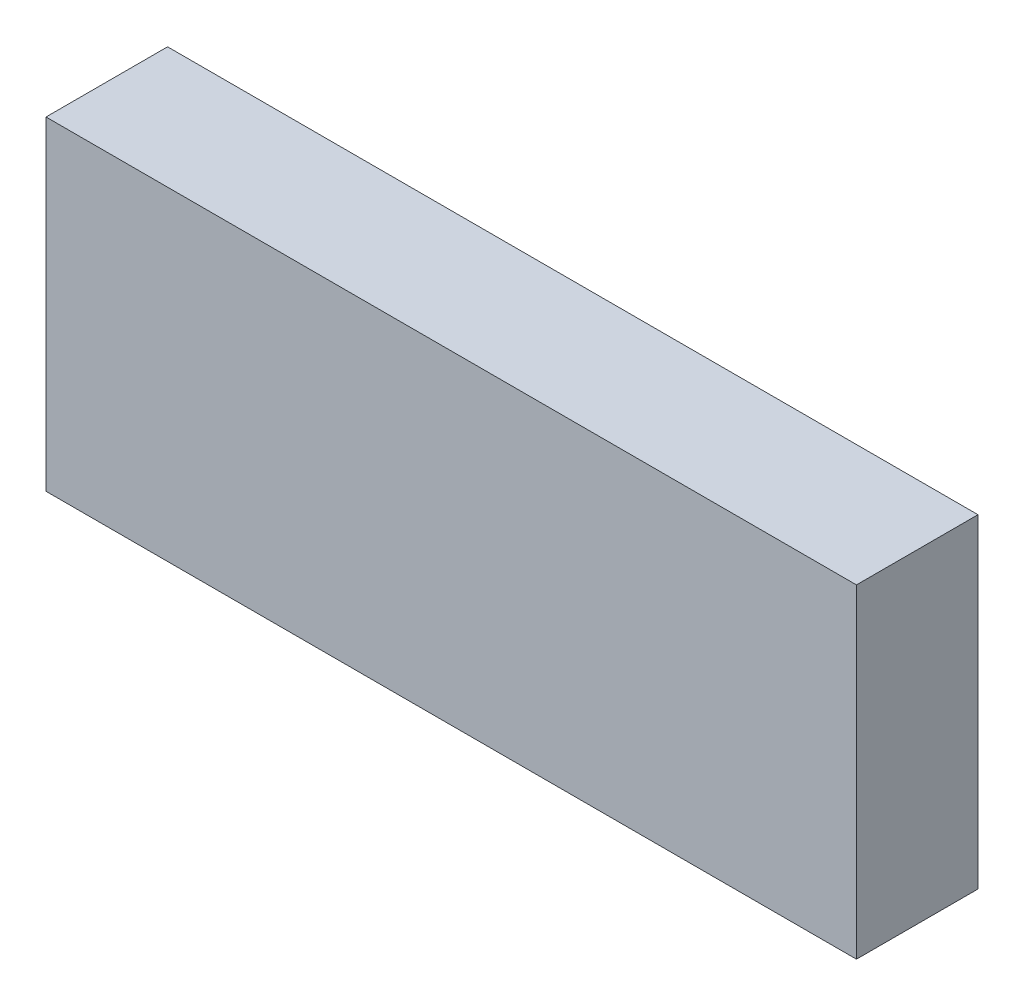
ISO-10303-21;
HEADER;
FILE_DESCRIPTION(('STEP AP214'),'2;1');
FILE_NAME('part.step','',(''),(''),'','','');
FILE_SCHEMA(('AUTOMOTIVE_DESIGN { 1 0 10303 214 1 1 1 1 }'));
ENDSEC;
DATA;
#1=APPLICATION_CONTEXT('core data for automotive mechanical design processes');
#2=APPLICATION_PROTOCOL_DEFINITION('international standard','automotive_design',2000,#1);
#3=PRODUCT_CONTEXT('',#1,'mechanical');
#4=PRODUCT('Part','Part','',(#3));
#5=PRODUCT_RELATED_PRODUCT_CATEGORY('part','',(#4));
#6=PRODUCT_DEFINITION_FORMATION('','',#4);
#7=PRODUCT_DEFINITION_CONTEXT('part definition',#1,'design');
#8=PRODUCT_DEFINITION('design','',#6,#7);
#9=PRODUCT_DEFINITION_SHAPE('','',#8);
#10=(LENGTH_UNIT() NAMED_UNIT(*) SI_UNIT(.MILLI.,.METRE.));
#11=(NAMED_UNIT(*) PLANE_ANGLE_UNIT() SI_UNIT($,.RADIAN.));
#12=(NAMED_UNIT(*) SI_UNIT($,.STERADIAN.) SOLID_ANGLE_UNIT());
#13=UNCERTAINTY_MEASURE_WITH_UNIT(LENGTH_MEASURE(1.E-05),#10,'distance_accuracy_value','');
#14=(GEOMETRIC_REPRESENTATION_CONTEXT(3) GLOBAL_UNCERTAINTY_ASSIGNED_CONTEXT((#13)) GLOBAL_UNIT_ASSIGNED_CONTEXT((#10,
#11,#12)) REPRESENTATION_CONTEXT('',''));
#15=CARTESIAN_POINT('',(0.,0.,0.));
#16=DIRECTION('',(0.,0.,1.));
#17=DIRECTION('',(1.,0.,0.));
#18=AXIS2_PLACEMENT_3D('',#15,#16,#17);
#19=CARTESIAN_POINT('',(-40.,32.,12.));
#20=DIRECTION('',(1.,0.,0.));
#21=DIRECTION('',(0.,0.,-1.));
#22=AXIS2_PLACEMENT_3D('',#19,#20,#21);
#23=PLANE('',#22);
#24=DIRECTION('',(0.,-1.,0.));
#25=VECTOR('',#24,1.);
#26=CARTESIAN_POINT('',(-40.,32.,0.));
#27=LINE('',#26,#25);
#28=CARTESIAN_POINT('',(-40.,32.,0.));
#29=VERTEX_POINT('',#28);
#30=CARTESIAN_POINT('',(-40.,0.,0.));
#31=VERTEX_POINT('',#30);
#32=EDGE_CURVE('E104',#29,#31,#27,.T.);
#33=ORIENTED_EDGE('',*,*,#32,.T.);
#34=DIRECTION('',(0.,0.,-1.));
#35=VECTOR('',#34,1.);
#36=CARTESIAN_POINT('',(-40.,0.,12.));
#37=LINE('',#36,#35);
#38=CARTESIAN_POINT('',(-40.,0.,12.));
#39=VERTEX_POINT('',#38);
#40=EDGE_CURVE('E11',#39,#31,#37,.T.);
#41=ORIENTED_EDGE('',*,*,#40,.F.);
#42=DIRECTION('',(0.,-1.,0.));
#43=VECTOR('',#42,1.);
#44=CARTESIAN_POINT('',(-40.,32.,12.));
#45=LINE('',#44,#43);
#46=CARTESIAN_POINT('',(-40.,32.,12.));
#47=VERTEX_POINT('',#46);
#48=EDGE_CURVE('E92',#47,#39,#45,.T.);
#49=ORIENTED_EDGE('',*,*,#48,.F.);
#50=DIRECTION('',(0.,0.,-1.));
#51=VECTOR('',#50,1.);
#52=CARTESIAN_POINT('',(-40.,32.,12.));
#53=LINE('',#52,#51);
#54=EDGE_CURVE('E100',#47,#29,#53,.T.);
#55=ORIENTED_EDGE('',*,*,#54,.T.);
#56=EDGE_LOOP('',(#33,#41,#49,#55));
#57=FACE_BOUND('',#56,.T.);
#58=ADVANCED_FACE('F41',(#57),#23,.F.);
#59=CARTESIAN_POINT('',(-40.,0.,12.));
#60=DIRECTION('',(0.,1.,0.));
#61=DIRECTION('',(0.,0.,1.));
#62=AXIS2_PLACEMENT_3D('',#59,#60,#61);
#63=PLANE('',#62);
#64=DIRECTION('',(1.,0.,0.));
#65=VECTOR('',#64,1.);
#66=CARTESIAN_POINT('',(-40.,0.,0.));
#67=LINE('',#66,#65);
#68=CARTESIAN_POINT('',(40.,0.,0.));
#69=VERTEX_POINT('',#68);
#70=EDGE_CURVE('E96',#31,#69,#67,.T.);
#71=ORIENTED_EDGE('',*,*,#70,.T.);
#72=DIRECTION('',(0.,0.,-1.));
#73=VECTOR('',#72,1.);
#74=CARTESIAN_POINT('',(40.,0.,12.));
#75=LINE('',#74,#73);
#76=CARTESIAN_POINT('',(40.,0.,12.));
#77=VERTEX_POINT('',#76);
#78=EDGE_CURVE('E49',#77,#69,#75,.T.);
#79=ORIENTED_EDGE('',*,*,#78,.F.);
#80=DIRECTION('',(1.,0.,0.));
#81=VECTOR('',#80,1.);
#82=CARTESIAN_POINT('',(-40.,0.,12.));
#83=LINE('',#82,#81);
#84=EDGE_CURVE('E87',#39,#77,#83,.T.);
#85=ORIENTED_EDGE('',*,*,#84,.F.);
#86=ORIENTED_EDGE('',*,*,#40,.T.);
#87=EDGE_LOOP('',(#71,#79,#85,#86));
#88=FACE_BOUND('',#87,.T.);
#89=ADVANCED_FACE('F95',(#88),#63,.F.);
#90=CARTESIAN_POINT('',(40.,0.,12.));
#91=DIRECTION('',(-1.,0.,0.));
#92=DIRECTION('',(0.,0.,1.));
#93=AXIS2_PLACEMENT_3D('',#90,#91,#92);
#94=PLANE('',#93);
#95=DIRECTION('',(0.,1.,0.));
#96=VECTOR('',#95,1.);
#97=CARTESIAN_POINT('',(40.,0.,0.));
#98=LINE('',#97,#96);
#99=CARTESIAN_POINT('',(40.,32.,0.));
#100=VERTEX_POINT('',#99);
#101=EDGE_CURVE('E74',#69,#100,#98,.T.);
#102=ORIENTED_EDGE('',*,*,#101,.T.);
#103=DIRECTION('',(0.,0.,-1.));
#104=VECTOR('',#103,1.);
#105=CARTESIAN_POINT('',(40.,32.,12.));
#106=LINE('',#105,#104);
#107=CARTESIAN_POINT('',(40.,32.,12.));
#108=VERTEX_POINT('',#107);
#109=EDGE_CURVE('E97',#108,#100,#106,.T.);
#110=ORIENTED_EDGE('',*,*,#109,.F.);
#111=DIRECTION('',(0.,1.,0.));
#112=VECTOR('',#111,1.);
#113=CARTESIAN_POINT('',(40.,0.,12.));
#114=LINE('',#113,#112);
#115=EDGE_CURVE('E90',#77,#108,#114,.T.);
#116=ORIENTED_EDGE('',*,*,#115,.F.);
#117=ORIENTED_EDGE('',*,*,#78,.T.);
#118=EDGE_LOOP('',(#102,#110,#116,#117));
#119=FACE_BOUND('',#118,.T.);
#120=ADVANCED_FACE('F98',(#119),#94,.F.);
#121=CARTESIAN_POINT('',(40.,32.,12.));
#122=DIRECTION('',(0.,-1.,0.));
#123=DIRECTION('',(0.,0.,-1.));
#124=AXIS2_PLACEMENT_3D('',#121,#122,#123);
#125=PLANE('',#124);
#126=DIRECTION('',(-1.,0.,0.));
#127=VECTOR('',#126,1.);
#128=CARTESIAN_POINT('',(40.,32.,0.));
#129=LINE('',#128,#127);
#130=EDGE_CURVE('E80',#100,#29,#129,.T.);
#131=ORIENTED_EDGE('',*,*,#130,.T.);
#132=ORIENTED_EDGE('',*,*,#54,.F.);
#133=DIRECTION('',(-1.,0.,0.));
#134=VECTOR('',#133,1.);
#135=CARTESIAN_POINT('',(40.,32.,12.));
#136=LINE('',#135,#134);
#137=EDGE_CURVE('E57',#108,#47,#136,.T.);
#138=ORIENTED_EDGE('',*,*,#137,.F.);
#139=ORIENTED_EDGE('',*,*,#109,.T.);
#140=EDGE_LOOP('',(#131,#132,#138,#139));
#141=FACE_BOUND('',#140,.T.);
#142=ADVANCED_FACE('F111',(#141),#125,.F.);
#143=CARTESIAN_POINT('',(0.,0.,12.));
#144=DIRECTION('',(0.,0.,1.));
#145=DIRECTION('',(1.,0.,0.));
#146=AXIS2_PLACEMENT_3D('',#143,#144,#145);
#147=PLANE('',#146);
#148=ORIENTED_EDGE('',*,*,#48,.T.);
#149=ORIENTED_EDGE('',*,*,#84,.T.);
#150=ORIENTED_EDGE('',*,*,#115,.T.);
#151=ORIENTED_EDGE('',*,*,#137,.T.);
#152=EDGE_LOOP('',(#148,#149,#150,#151));
#153=FACE_BOUND('',#152,.T.);
#154=ADVANCED_FACE('F88',(#153),#147,.T.);
#155=CARTESIAN_POINT('',(0.,0.,0.));
#156=DIRECTION('',(0.,0.,1.));
#157=DIRECTION('',(1.,0.,0.));
#158=AXIS2_PLACEMENT_3D('',#155,#156,#157);
#159=PLANE('',#158);
#160=ORIENTED_EDGE('',*,*,#32,.F.);
#161=ORIENTED_EDGE('',*,*,#130,.F.);
#162=ORIENTED_EDGE('',*,*,#101,.F.);
#163=ORIENTED_EDGE('',*,*,#70,.F.);
#164=EDGE_LOOP('',(#160,#161,#162,#163));
#165=FACE_BOUND('',#164,.T.);
#166=ADVANCED_FACE('F114',(#165),#159,.F.);
#167=CLOSED_SHELL('',(#58,#89,#120,#142,#154,#166));
#168=MANIFOLD_SOLID_BREP('B2',#167);
#169=ADVANCED_BREP_SHAPE_REPRESENTATION('',(#18,#168),#14);
#170=SHAPE_DEFINITION_REPRESENTATION(#9,#169);
ENDSEC;
END-ISO-10303-21;
